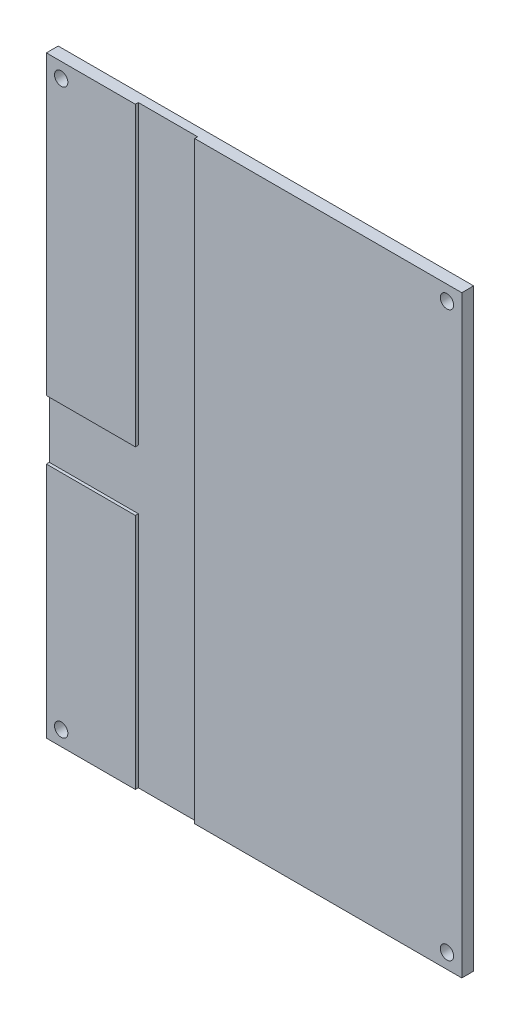
ISO-10303-21;
HEADER;
FILE_DESCRIPTION(('STEP AP214'),'2;1');
FILE_NAME('part.step','',(''),(''),'','','');
FILE_SCHEMA(('AUTOMOTIVE_DESIGN { 1 0 10303 214 1 1 1 1 }'));
ENDSEC;
DATA;
#1=APPLICATION_CONTEXT('core data for automotive mechanical design processes');
#2=APPLICATION_PROTOCOL_DEFINITION('international standard','automotive_design',2000,#1);
#3=PRODUCT_CONTEXT('',#1,'mechanical');
#4=PRODUCT('Part','Part','',(#3));
#5=PRODUCT_RELATED_PRODUCT_CATEGORY('part','',(#4));
#6=PRODUCT_DEFINITION_FORMATION('','',#4);
#7=PRODUCT_DEFINITION_CONTEXT('part definition',#1,'design');
#8=PRODUCT_DEFINITION('design','',#6,#7);
#9=PRODUCT_DEFINITION_SHAPE('','',#8);
#10=(LENGTH_UNIT() NAMED_UNIT(*) SI_UNIT(.MILLI.,.METRE.));
#11=(NAMED_UNIT(*) PLANE_ANGLE_UNIT() SI_UNIT($,.RADIAN.));
#12=(NAMED_UNIT(*) SI_UNIT($,.STERADIAN.) SOLID_ANGLE_UNIT());
#13=UNCERTAINTY_MEASURE_WITH_UNIT(LENGTH_MEASURE(1.E-05),#10,'distance_accuracy_value','');
#14=(GEOMETRIC_REPRESENTATION_CONTEXT(3) GLOBAL_UNCERTAINTY_ASSIGNED_CONTEXT((#13)) GLOBAL_UNIT_ASSIGNED_CONTEXT((#10,
#11,#12)) REPRESENTATION_CONTEXT('',''));
#15=CARTESIAN_POINT('',(0.,0.,0.));
#16=DIRECTION('',(0.,0.,1.));
#17=DIRECTION('',(1.,0.,0.));
#18=AXIS2_PLACEMENT_3D('',#15,#16,#17);
#19=CARTESIAN_POINT('',(0.,0.,4.));
#20=DIRECTION('',(0.,0.,-1.));
#21=DIRECTION('',(-1.,0.,0.));
#22=AXIS2_PLACEMENT_3D('',#19,#20,#21);
#23=PLANE('',#22);
#24=DIRECTION('',(0.,-1.,0.));
#25=VECTOR('',#24,1.);
#26=CARTESIAN_POINT('',(-70.,-100.,4.));
#27=LINE('',#26,#25);
#28=CARTESIAN_POINT('',(-70.,100.,4.));
#29=VERTEX_POINT('',#28);
#30=CARTESIAN_POINT('',(-70.,0.,4.));
#31=VERTEX_POINT('',#30);
#32=EDGE_CURVE('E176',#29,#31,#27,.T.);
#33=ORIENTED_EDGE('',*,*,#32,.T.);
#34=DIRECTION('',(-1.,0.,0.));
#35=VECTOR('',#34,1.);
#36=CARTESIAN_POINT('',(-40.,0.,4.));
#37=LINE('',#36,#35);
#38=CARTESIAN_POINT('',(-40.,0.,4.));
#39=VERTEX_POINT('',#38);
#40=EDGE_CURVE('E231',#39,#31,#37,.T.);
#41=ORIENTED_EDGE('',*,*,#40,.F.);
#42=DIRECTION('',(0.,-1.,0.));
#43=VECTOR('',#42,1.);
#44=CARTESIAN_POINT('',(-40.,100.,4.));
#45=LINE('',#44,#43);
#46=CARTESIAN_POINT('',(-40.,100.,4.));
#47=VERTEX_POINT('',#46);
#48=EDGE_CURVE('E232',#47,#39,#45,.T.);
#49=ORIENTED_EDGE('',*,*,#48,.F.);
#50=DIRECTION('',(-1.,0.,0.));
#51=VECTOR('',#50,1.);
#52=CARTESIAN_POINT('',(-70.,100.,4.));
#53=LINE('',#52,#51);
#54=EDGE_CURVE('E164',#47,#29,#53,.T.);
#55=ORIENTED_EDGE('',*,*,#54,.T.);
#56=EDGE_LOOP('',(#33,#41,#49,#55));
#57=FACE_BOUND('',#56,.T.);
#58=CARTESIAN_POINT('',(-65.,95.,4.));
#59=DIRECTION('',(0.,0.,1.));
#60=DIRECTION('',(1.,0.,0.));
#61=AXIS2_PLACEMENT_3D('',#58,#59,#60);
#62=CIRCLE('',#61,2.24999999999999);
#63=CARTESIAN_POINT('',(-62.75,95.,4.));
#64=VERTEX_POINT('',#63);
#65=EDGE_CURVE('E263',#64,#64,#62,.T.);
#66=ORIENTED_EDGE('',*,*,#65,.F.);
#67=EDGE_LOOP('',(#66));
#68=FACE_BOUND('',#67,.T.);
#69=ADVANCED_FACE('F45',(#57,#68),#23,.F.);
#70=CARTESIAN_POINT('',(65.,95.,4.));
#71=DIRECTION('',(0.,0.,1.));
#72=DIRECTION('',(1.,0.,0.));
#73=AXIS2_PLACEMENT_3D('',#70,#71,#72);
#74=CIRCLE('',#73,2.24999999999999);
#75=CARTESIAN_POINT('',(67.25,95.,4.));
#76=VERTEX_POINT('',#75);
#77=EDGE_CURVE('E238',#76,#76,#74,.T.);
#78=ORIENTED_EDGE('',*,*,#77,.F.);
#79=EDGE_LOOP('',(#78));
#80=FACE_BOUND('',#79,.T.);
#81=CARTESIAN_POINT('',(70.,100.,4.));
#82=VERTEX_POINT('',#81);
#83=CARTESIAN_POINT('',(-20.,100.,4.));
#84=VERTEX_POINT('',#83);
#85=EDGE_CURVE('E98',#82,#84,#53,.T.);
#86=ORIENTED_EDGE('',*,*,#85,.T.);
#87=DIRECTION('',(0.,1.,0.));
#88=VECTOR('',#87,1.);
#89=CARTESIAN_POINT('',(-20.,-100.,4.));
#90=LINE('',#89,#88);
#91=CARTESIAN_POINT('',(-20.,-100.,4.));
#92=VERTEX_POINT('',#91);
#93=EDGE_CURVE('E159',#92,#84,#90,.T.);
#94=ORIENTED_EDGE('',*,*,#93,.F.);
#95=DIRECTION('',(1.,0.,0.));
#96=VECTOR('',#95,1.);
#97=CARTESIAN_POINT('',(-70.,-100.,4.));
#98=LINE('',#97,#96);
#99=CARTESIAN_POINT('',(70.,-100.,4.));
#100=VERTEX_POINT('',#99);
#101=EDGE_CURVE('E69',#92,#100,#98,.T.);
#102=ORIENTED_EDGE('',*,*,#101,.T.);
#103=DIRECTION('',(0.,1.,0.));
#104=VECTOR('',#103,1.);
#105=CARTESIAN_POINT('',(70.,-100.,4.));
#106=LINE('',#105,#104);
#107=EDGE_CURVE('E172',#100,#82,#106,.T.);
#108=ORIENTED_EDGE('',*,*,#107,.T.);
#109=EDGE_LOOP('',(#86,#94,#102,#108));
#110=FACE_BOUND('',#109,.T.);
#111=CARTESIAN_POINT('',(65.0000000000001,-95.,4.));
#112=DIRECTION('',(0.,0.,1.));
#113=DIRECTION('',(1.,0.,0.));
#114=AXIS2_PLACEMENT_3D('',#111,#112,#113);
#115=CIRCLE('',#114,2.24999999999999);
#116=CARTESIAN_POINT('',(67.25,-95.,4.));
#117=VERTEX_POINT('',#116);
#118=EDGE_CURVE('E254',#117,#117,#115,.T.);
#119=ORIENTED_EDGE('',*,*,#118,.F.);
#120=EDGE_LOOP('',(#119));
#121=FACE_BOUND('',#120,.T.);
#122=ADVANCED_FACE('F246',(#80,#110,#121),#23,.F.);
#123=CARTESIAN_POINT('',(-70.,-100.,4.));
#124=VERTEX_POINT('',#123);
#125=CARTESIAN_POINT('',(-40.,-100.,4.));
#126=VERTEX_POINT('',#125);
#127=EDGE_CURVE('E179',#124,#126,#98,.T.);
#128=ORIENTED_EDGE('',*,*,#127,.T.);
#129=DIRECTION('',(0.,-1.,0.));
#130=VECTOR('',#129,1.);
#131=CARTESIAN_POINT('',(-40.,-20.,4.));
#132=LINE('',#131,#130);
#133=CARTESIAN_POINT('',(-40.,-20.,4.));
#134=VERTEX_POINT('',#133);
#135=EDGE_CURVE('E244',#134,#126,#132,.T.);
#136=ORIENTED_EDGE('',*,*,#135,.F.);
#137=DIRECTION('',(1.,0.,0.));
#138=VECTOR('',#137,1.);
#139=CARTESIAN_POINT('',(-70.,-20.,4.));
#140=LINE('',#139,#138);
#141=CARTESIAN_POINT('',(-70.,-20.,4.));
#142=VERTEX_POINT('',#141);
#143=EDGE_CURVE('E235',#142,#134,#140,.T.);
#144=ORIENTED_EDGE('',*,*,#143,.F.);
#145=EDGE_CURVE('E175',#142,#124,#27,.T.);
#146=ORIENTED_EDGE('',*,*,#145,.T.);
#147=EDGE_LOOP('',(#128,#136,#144,#146));
#148=FACE_BOUND('',#147,.T.);
#149=CARTESIAN_POINT('',(-65.,-95.,4.));
#150=DIRECTION('',(0.,0.,1.));
#151=DIRECTION('',(1.,0.,0.));
#152=AXIS2_PLACEMENT_3D('',#149,#150,#151);
#153=CIRCLE('',#152,2.24999999999999);
#154=CARTESIAN_POINT('',(-62.75,-95.,4.));
#155=VERTEX_POINT('',#154);
#156=EDGE_CURVE('E260',#155,#155,#153,.T.);
#157=ORIENTED_EDGE('',*,*,#156,.F.);
#158=EDGE_LOOP('',(#157));
#159=FACE_BOUND('',#158,.T.);
#160=ADVANCED_FACE('F249',(#148,#159),#23,.F.);
#161=CARTESIAN_POINT('',(70.,-100.,4.));
#162=DIRECTION('',(-1.,0.,0.));
#163=DIRECTION('',(0.,0.,1.));
#164=AXIS2_PLACEMENT_3D('',#161,#162,#163);
#165=PLANE('',#164);
#166=DIRECTION('',(0.,1.,0.));
#167=VECTOR('',#166,1.);
#168=CARTESIAN_POINT('',(70.,-100.,0.));
#169=LINE('',#168,#167);
#170=CARTESIAN_POINT('',(70.,-100.,0.));
#171=VERTEX_POINT('',#170);
#172=CARTESIAN_POINT('',(70.,100.,0.));
#173=VERTEX_POINT('',#172);
#174=EDGE_CURVE('E183',#171,#173,#169,.T.);
#175=ORIENTED_EDGE('',*,*,#174,.T.);
#176=DIRECTION('',(0.,0.,-1.));
#177=VECTOR('',#176,1.);
#178=CARTESIAN_POINT('',(70.,100.,4.));
#179=LINE('',#178,#177);
#180=EDGE_CURVE('E11',#82,#173,#179,.T.);
#181=ORIENTED_EDGE('',*,*,#180,.F.);
#182=ORIENTED_EDGE('',*,*,#107,.F.);
#183=DIRECTION('',(0.,0.,-1.));
#184=VECTOR('',#183,1.);
#185=CARTESIAN_POINT('',(70.,-100.,4.));
#186=LINE('',#185,#184);
#187=EDGE_CURVE('E182',#100,#171,#186,.T.);
#188=ORIENTED_EDGE('',*,*,#187,.T.);
#189=EDGE_LOOP('',(#175,#181,#182,#188));
#190=FACE_BOUND('',#189,.T.);
#191=ADVANCED_FACE('F47',(#190),#165,.F.);
#192=CARTESIAN_POINT('',(-70.,100.,4.));
#193=DIRECTION('',(0.,-1.,0.));
#194=DIRECTION('',(0.,0.,-1.));
#195=AXIS2_PLACEMENT_3D('',#192,#193,#194);
#196=PLANE('',#195);
#197=DIRECTION('',(-1.,0.,0.));
#198=VECTOR('',#197,1.);
#199=CARTESIAN_POINT('',(-20.,100.,3.));
#200=LINE('',#199,#198);
#201=CARTESIAN_POINT('',(-20.,100.,3.));
#202=VERTEX_POINT('',#201);
#203=CARTESIAN_POINT('',(-40.,100.,3.));
#204=VERTEX_POINT('',#203);
#205=EDGE_CURVE('E152',#202,#204,#200,.T.);
#206=ORIENTED_EDGE('',*,*,#205,.F.);
#207=DIRECTION('',(0.,0.,1.));
#208=VECTOR('',#207,1.);
#209=CARTESIAN_POINT('',(-20.,100.,3.));
#210=LINE('',#209,#208);
#211=EDGE_CURVE('E187',#202,#84,#210,.T.);
#212=ORIENTED_EDGE('',*,*,#211,.T.);
#213=ORIENTED_EDGE('',*,*,#85,.F.);
#214=ORIENTED_EDGE('',*,*,#180,.T.);
#215=DIRECTION('',(-1.,0.,0.));
#216=VECTOR('',#215,1.);
#217=CARTESIAN_POINT('',(-70.,100.,0.));
#218=LINE('',#217,#216);
#219=CARTESIAN_POINT('',(-70.,100.,0.));
#220=VERTEX_POINT('',#219);
#221=EDGE_CURVE('E186',#173,#220,#218,.T.);
#222=ORIENTED_EDGE('',*,*,#221,.T.);
#223=DIRECTION('',(0.,0.,-1.));
#224=VECTOR('',#223,1.);
#225=CARTESIAN_POINT('',(-70.,100.,4.));
#226=LINE('',#225,#224);
#227=EDGE_CURVE('E53',#29,#220,#226,.T.);
#228=ORIENTED_EDGE('',*,*,#227,.F.);
#229=ORIENTED_EDGE('',*,*,#54,.F.);
#230=DIRECTION('',(0.,0.,1.));
#231=VECTOR('',#230,1.);
#232=CARTESIAN_POINT('',(-40.,100.,3.));
#233=LINE('',#232,#231);
#234=EDGE_CURVE('E60',#204,#47,#233,.T.);
#235=ORIENTED_EDGE('',*,*,#234,.F.);
#236=EDGE_LOOP('',(#206,#212,#213,#214,#222,#228,#229,#235));
#237=FACE_BOUND('',#236,.T.);
#238=ADVANCED_FACE('F162',(#237),#196,.F.);
#239=CARTESIAN_POINT('',(-70.,-100.,4.));
#240=DIRECTION('',(1.,0.,0.));
#241=DIRECTION('',(0.,0.,-1.));
#242=AXIS2_PLACEMENT_3D('',#239,#240,#241);
#243=PLANE('',#242);
#244=ORIENTED_EDGE('',*,*,#145,.F.);
#245=DIRECTION('',(0.,0.,1.));
#246=VECTOR('',#245,1.);
#247=CARTESIAN_POINT('',(-70.,-20.,3.));
#248=LINE('',#247,#246);
#249=CARTESIAN_POINT('',(-70.,-20.,3.));
#250=VERTEX_POINT('',#249);
#251=EDGE_CURVE('E222',#250,#142,#248,.T.);
#252=ORIENTED_EDGE('',*,*,#251,.F.);
#253=DIRECTION('',(0.,-1.,0.));
#254=VECTOR('',#253,1.);
#255=CARTESIAN_POINT('',(-70.,0.,3.));
#256=LINE('',#255,#254);
#257=CARTESIAN_POINT('',(-70.,0.,3.));
#258=VERTEX_POINT('',#257);
#259=EDGE_CURVE('E226',#258,#250,#256,.T.);
#260=ORIENTED_EDGE('',*,*,#259,.F.);
#261=DIRECTION('',(0.,0.,1.));
#262=VECTOR('',#261,1.);
#263=CARTESIAN_POINT('',(-70.,0.,3.));
#264=LINE('',#263,#262);
#265=EDGE_CURVE('E166',#258,#31,#264,.T.);
#266=ORIENTED_EDGE('',*,*,#265,.T.);
#267=ORIENTED_EDGE('',*,*,#32,.F.);
#268=ORIENTED_EDGE('',*,*,#227,.T.);
#269=DIRECTION('',(0.,-1.,0.));
#270=VECTOR('',#269,1.);
#271=CARTESIAN_POINT('',(-70.,-100.,0.));
#272=LINE('',#271,#270);
#273=CARTESIAN_POINT('',(-70.,-100.,0.));
#274=VERTEX_POINT('',#273);
#275=EDGE_CURVE('E189',#220,#274,#272,.T.);
#276=ORIENTED_EDGE('',*,*,#275,.T.);
#277=DIRECTION('',(0.,0.,-1.));
#278=VECTOR('',#277,1.);
#279=CARTESIAN_POINT('',(-70.,-100.,4.));
#280=LINE('',#279,#278);
#281=EDGE_CURVE('E193',#124,#274,#280,.T.);
#282=ORIENTED_EDGE('',*,*,#281,.F.);
#283=EDGE_LOOP('',(#244,#252,#260,#266,#267,#268,#276,#282));
#284=FACE_BOUND('',#283,.T.);
#285=ADVANCED_FACE('F199',(#284),#243,.F.);
#286=CARTESIAN_POINT('',(-70.,-100.,4.));
#287=DIRECTION('',(0.,1.,0.));
#288=DIRECTION('',(0.,0.,1.));
#289=AXIS2_PLACEMENT_3D('',#286,#287,#288);
#290=PLANE('',#289);
#291=ORIENTED_EDGE('',*,*,#101,.F.);
#292=DIRECTION('',(0.,0.,1.));
#293=VECTOR('',#292,1.);
#294=CARTESIAN_POINT('',(-20.,-100.,3.));
#295=LINE('',#294,#293);
#296=CARTESIAN_POINT('',(-20.,-100.,3.));
#297=VERTEX_POINT('',#296);
#298=EDGE_CURVE('E211',#297,#92,#295,.T.);
#299=ORIENTED_EDGE('',*,*,#298,.F.);
#300=DIRECTION('',(1.,0.,0.));
#301=VECTOR('',#300,1.);
#302=CARTESIAN_POINT('',(-40.,-100.,3.));
#303=LINE('',#302,#301);
#304=CARTESIAN_POINT('',(-40.,-100.,3.));
#305=VERTEX_POINT('',#304);
#306=EDGE_CURVE('E168',#305,#297,#303,.T.);
#307=ORIENTED_EDGE('',*,*,#306,.F.);
#308=DIRECTION('',(0.,0.,1.));
#309=VECTOR('',#308,1.);
#310=CARTESIAN_POINT('',(-40.,-100.,3.));
#311=LINE('',#310,#309);
#312=EDGE_CURVE('E214',#305,#126,#311,.T.);
#313=ORIENTED_EDGE('',*,*,#312,.T.);
#314=ORIENTED_EDGE('',*,*,#127,.F.);
#315=ORIENTED_EDGE('',*,*,#281,.T.);
#316=DIRECTION('',(1.,0.,0.));
#317=VECTOR('',#316,1.);
#318=CARTESIAN_POINT('',(-70.,-100.,0.));
#319=LINE('',#318,#317);
#320=EDGE_CURVE('E91',#274,#171,#319,.T.);
#321=ORIENTED_EDGE('',*,*,#320,.T.);
#322=ORIENTED_EDGE('',*,*,#187,.F.);
#323=EDGE_LOOP('',(#291,#299,#307,#313,#314,#315,#321,#322));
#324=FACE_BOUND('',#323,.T.);
#325=ADVANCED_FACE('F208',(#324),#290,.F.);
#326=CARTESIAN_POINT('',(0.,0.,0.));
#327=DIRECTION('',(0.,0.,-1.));
#328=DIRECTION('',(-1.,0.,0.));
#329=AXIS2_PLACEMENT_3D('',#326,#327,#328);
#330=PLANE('',#329);
#331=CARTESIAN_POINT('',(-65.,95.,0.));
#332=DIRECTION('',(0.,0.,-1.));
#333=DIRECTION('',(-1.,0.,0.));
#334=AXIS2_PLACEMENT_3D('',#331,#332,#333);
#335=CIRCLE('',#334,2.25);
#336=CARTESIAN_POINT('',(-67.25,95.,0.));
#337=VERTEX_POINT('',#336);
#338=EDGE_CURVE('E257',#337,#337,#335,.T.);
#339=ORIENTED_EDGE('',*,*,#338,.F.);
#340=EDGE_LOOP('',(#339));
#341=FACE_BOUND('',#340,.T.);
#342=CARTESIAN_POINT('',(65.0000000000001,-95.,0.));
#343=DIRECTION('',(0.,0.,-1.));
#344=DIRECTION('',(-1.,0.,0.));
#345=AXIS2_PLACEMENT_3D('',#342,#343,#344);
#346=CIRCLE('',#345,2.25);
#347=CARTESIAN_POINT('',(62.7500000000001,-95.,0.));
#348=VERTEX_POINT('',#347);
#349=EDGE_CURVE('E256',#348,#348,#346,.T.);
#350=ORIENTED_EDGE('',*,*,#349,.F.);
#351=EDGE_LOOP('',(#350));
#352=FACE_BOUND('',#351,.T.);
#353=CARTESIAN_POINT('',(-65.,-95.,0.));
#354=DIRECTION('',(0.,0.,-1.));
#355=DIRECTION('',(-1.,0.,0.));
#356=AXIS2_PLACEMENT_3D('',#353,#354,#355);
#357=CIRCLE('',#356,2.25);
#358=CARTESIAN_POINT('',(-67.2499999999999,-95.,0.));
#359=VERTEX_POINT('',#358);
#360=EDGE_CURVE('E269',#359,#359,#357,.T.);
#361=ORIENTED_EDGE('',*,*,#360,.F.);
#362=EDGE_LOOP('',(#361));
#363=FACE_BOUND('',#362,.T.);
#364=CARTESIAN_POINT('',(65.,95.,0.));
#365=DIRECTION('',(0.,0.,-1.));
#366=DIRECTION('',(-1.,0.,0.));
#367=AXIS2_PLACEMENT_3D('',#364,#365,#366);
#368=CIRCLE('',#367,2.25);
#369=CARTESIAN_POINT('',(62.75,95.,0.));
#370=VERTEX_POINT('',#369);
#371=EDGE_CURVE('E233',#370,#370,#368,.T.);
#372=ORIENTED_EDGE('',*,*,#371,.F.);
#373=EDGE_LOOP('',(#372));
#374=FACE_BOUND('',#373,.T.);
#375=ORIENTED_EDGE('',*,*,#174,.F.);
#376=ORIENTED_EDGE('',*,*,#320,.F.);
#377=ORIENTED_EDGE('',*,*,#275,.F.);
#378=ORIENTED_EDGE('',*,*,#221,.F.);
#379=EDGE_LOOP('',(#375,#376,#377,#378));
#380=FACE_BOUND('',#379,.T.);
#381=ADVANCED_FACE('F204',(#341,#352,#363,#374,#380),#330,.T.);
#382=CARTESIAN_POINT('',(-20.,-100.,3.));
#383=DIRECTION('',(1.,0.,0.));
#384=DIRECTION('',(0.,1.,0.));
#385=AXIS2_PLACEMENT_3D('',#382,#383,#384);
#386=PLANE('',#385);
#387=ORIENTED_EDGE('',*,*,#93,.T.);
#388=ORIENTED_EDGE('',*,*,#211,.F.);
#389=DIRECTION('',(0.,1.,0.));
#390=VECTOR('',#389,1.);
#391=CARTESIAN_POINT('',(-20.,-100.,3.));
#392=LINE('',#391,#390);
#393=EDGE_CURVE('E158',#297,#202,#392,.T.);
#394=ORIENTED_EDGE('',*,*,#393,.F.);
#395=ORIENTED_EDGE('',*,*,#298,.T.);
#396=EDGE_LOOP('',(#387,#388,#394,#395));
#397=FACE_BOUND('',#396,.T.);
#398=ADVANCED_FACE('F245',(#397),#386,.F.);
#399=CARTESIAN_POINT('',(-40.,-20.,3.));
#400=DIRECTION('',(-1.,0.,0.));
#401=DIRECTION('',(0.,-1.,0.));
#402=AXIS2_PLACEMENT_3D('',#399,#400,#401);
#403=PLANE('',#402);
#404=ORIENTED_EDGE('',*,*,#135,.T.);
#405=ORIENTED_EDGE('',*,*,#312,.F.);
#406=DIRECTION('',(0.,-1.,0.));
#407=VECTOR('',#406,1.);
#408=CARTESIAN_POINT('',(-40.,-20.,3.));
#409=LINE('',#408,#407);
#410=CARTESIAN_POINT('',(-40.,-20.,3.));
#411=VERTEX_POINT('',#410);
#412=EDGE_CURVE('E279',#411,#305,#409,.T.);
#413=ORIENTED_EDGE('',*,*,#412,.F.);
#414=DIRECTION('',(0.,0.,1.));
#415=VECTOR('',#414,1.);
#416=CARTESIAN_POINT('',(-40.,-20.,3.));
#417=LINE('',#416,#415);
#418=EDGE_CURVE('E217',#411,#134,#417,.T.);
#419=ORIENTED_EDGE('',*,*,#418,.T.);
#420=EDGE_LOOP('',(#404,#405,#413,#419));
#421=FACE_BOUND('',#420,.T.);
#422=ADVANCED_FACE('F283',(#421),#403,.F.);
#423=CARTESIAN_POINT('',(-70.,-20.,3.));
#424=DIRECTION('',(0.,-1.,0.));
#425=DIRECTION('',(0.,0.,-1.));
#426=AXIS2_PLACEMENT_3D('',#423,#424,#425);
#427=PLANE('',#426);
#428=ORIENTED_EDGE('',*,*,#143,.T.);
#429=ORIENTED_EDGE('',*,*,#418,.F.);
#430=DIRECTION('',(1.,0.,0.));
#431=VECTOR('',#430,1.);
#432=CARTESIAN_POINT('',(-70.,-20.,3.));
#433=LINE('',#432,#431);
#434=EDGE_CURVE('E276',#250,#411,#433,.T.);
#435=ORIENTED_EDGE('',*,*,#434,.F.);
#436=ORIENTED_EDGE('',*,*,#251,.T.);
#437=EDGE_LOOP('',(#428,#429,#435,#436));
#438=FACE_BOUND('',#437,.T.);
#439=ADVANCED_FACE('F290',(#438),#427,.F.);
#440=CARTESIAN_POINT('',(-40.,0.,3.));
#441=DIRECTION('',(0.,1.,0.));
#442=DIRECTION('',(-1.,0.,0.));
#443=AXIS2_PLACEMENT_3D('',#440,#441,#442);
#444=PLANE('',#443);
#445=ORIENTED_EDGE('',*,*,#40,.T.);
#446=ORIENTED_EDGE('',*,*,#265,.F.);
#447=DIRECTION('',(-1.,0.,0.));
#448=VECTOR('',#447,1.);
#449=CARTESIAN_POINT('',(-40.,0.,3.));
#450=LINE('',#449,#448);
#451=CARTESIAN_POINT('',(-40.,0.,3.));
#452=VERTEX_POINT('',#451);
#453=EDGE_CURVE('E151',#452,#258,#450,.T.);
#454=ORIENTED_EDGE('',*,*,#453,.F.);
#455=DIRECTION('',(0.,0.,1.));
#456=VECTOR('',#455,1.);
#457=CARTESIAN_POINT('',(-40.,0.,3.));
#458=LINE('',#457,#456);
#459=EDGE_CURVE('E147',#452,#39,#458,.T.);
#460=ORIENTED_EDGE('',*,*,#459,.T.);
#461=EDGE_LOOP('',(#445,#446,#454,#460));
#462=FACE_BOUND('',#461,.T.);
#463=ADVANCED_FACE('F291',(#462),#444,.F.);
#464=CARTESIAN_POINT('',(-40.,100.,3.));
#465=DIRECTION('',(-1.,0.,0.));
#466=DIRECTION('',(0.,-1.,0.));
#467=AXIS2_PLACEMENT_3D('',#464,#465,#466);
#468=PLANE('',#467);
#469=ORIENTED_EDGE('',*,*,#48,.T.);
#470=ORIENTED_EDGE('',*,*,#459,.F.);
#471=DIRECTION('',(0.,-1.,0.));
#472=VECTOR('',#471,1.);
#473=CARTESIAN_POINT('',(-40.,100.,3.));
#474=LINE('',#473,#472);
#475=EDGE_CURVE('E144',#204,#452,#474,.T.);
#476=ORIENTED_EDGE('',*,*,#475,.F.);
#477=ORIENTED_EDGE('',*,*,#234,.T.);
#478=EDGE_LOOP('',(#469,#470,#476,#477));
#479=FACE_BOUND('',#478,.T.);
#480=ADVANCED_FACE('F146',(#479),#468,.F.);
#481=CARTESIAN_POINT('',(0.,0.,3.));
#482=DIRECTION('',(0.,0.,1.));
#483=DIRECTION('',(1.,0.,0.));
#484=AXIS2_PLACEMENT_3D('',#481,#482,#483);
#485=PLANE('',#484);
#486=ORIENTED_EDGE('',*,*,#205,.T.);
#487=ORIENTED_EDGE('',*,*,#475,.T.);
#488=ORIENTED_EDGE('',*,*,#453,.T.);
#489=ORIENTED_EDGE('',*,*,#259,.T.);
#490=ORIENTED_EDGE('',*,*,#434,.T.);
#491=ORIENTED_EDGE('',*,*,#412,.T.);
#492=ORIENTED_EDGE('',*,*,#306,.T.);
#493=ORIENTED_EDGE('',*,*,#393,.T.);
#494=EDGE_LOOP('',(#486,#487,#488,#489,#490,#491,#492,#493));
#495=FACE_BOUND('',#494,.T.);
#496=ADVANCED_FACE('F156',(#495),#485,.T.);
#497=CARTESIAN_POINT('',(65.,95.,4.));
#498=DIRECTION('',(0.,0.,1.));
#499=DIRECTION('',(1.,0.,0.));
#500=AXIS2_PLACEMENT_3D('',#497,#498,#499);
#501=CYLINDRICAL_SURFACE('',#500,2.25);
#502=ORIENTED_EDGE('',*,*,#77,.T.);
#503=EDGE_LOOP('',(#502));
#504=FACE_BOUND('',#503,.T.);
#505=ORIENTED_EDGE('',*,*,#371,.T.);
#506=EDGE_LOOP('',(#505));
#507=FACE_BOUND('',#506,.T.);
#508=ADVANCED_FACE('F333',(#504,#507),#501,.F.);
#509=CARTESIAN_POINT('',(-65.,-95.,4.));
#510=DIRECTION('',(0.,0.,1.));
#511=DIRECTION('',(1.,0.,0.));
#512=AXIS2_PLACEMENT_3D('',#509,#510,#511);
#513=CYLINDRICAL_SURFACE('',#512,2.25);
#514=ORIENTED_EDGE('',*,*,#156,.T.);
#515=EDGE_LOOP('',(#514));
#516=FACE_BOUND('',#515,.T.);
#517=ORIENTED_EDGE('',*,*,#360,.T.);
#518=EDGE_LOOP('',(#517));
#519=FACE_BOUND('',#518,.T.);
#520=ADVANCED_FACE('F334',(#516,#519),#513,.F.);
#521=CARTESIAN_POINT('',(65.0000000000001,-95.,4.));
#522=DIRECTION('',(0.,0.,1.));
#523=DIRECTION('',(1.,0.,0.));
#524=AXIS2_PLACEMENT_3D('',#521,#522,#523);
#525=CYLINDRICAL_SURFACE('',#524,2.25);
#526=ORIENTED_EDGE('',*,*,#118,.T.);
#527=EDGE_LOOP('',(#526));
#528=FACE_BOUND('',#527,.T.);
#529=ORIENTED_EDGE('',*,*,#349,.T.);
#530=EDGE_LOOP('',(#529));
#531=FACE_BOUND('',#530,.T.);
#532=ADVANCED_FACE('F340',(#528,#531),#525,.F.);
#533=CARTESIAN_POINT('',(-65.,95.,4.));
#534=DIRECTION('',(0.,0.,1.));
#535=DIRECTION('',(1.,0.,0.));
#536=AXIS2_PLACEMENT_3D('',#533,#534,#535);
#537=CYLINDRICAL_SURFACE('',#536,2.25);
#538=ORIENTED_EDGE('',*,*,#65,.T.);
#539=EDGE_LOOP('',(#538));
#540=FACE_BOUND('',#539,.T.);
#541=ORIENTED_EDGE('',*,*,#338,.T.);
#542=EDGE_LOOP('',(#541));
#543=FACE_BOUND('',#542,.T.);
#544=ADVANCED_FACE('F405',(#540,#543),#537,.F.);
#545=CLOSED_SHELL('',(#69,#122,#160,#191,#238,#285,#325,#381,#398,#422,#439,#463,#480,#496,#508,
#520,#532,#544));
#546=MANIFOLD_SOLID_BREP('B2',#545);
#547=ADVANCED_BREP_SHAPE_REPRESENTATION('',(#18,#546),#14);
#548=SHAPE_DEFINITION_REPRESENTATION(#9,#547);
ENDSEC;
END-ISO-10303-21;
